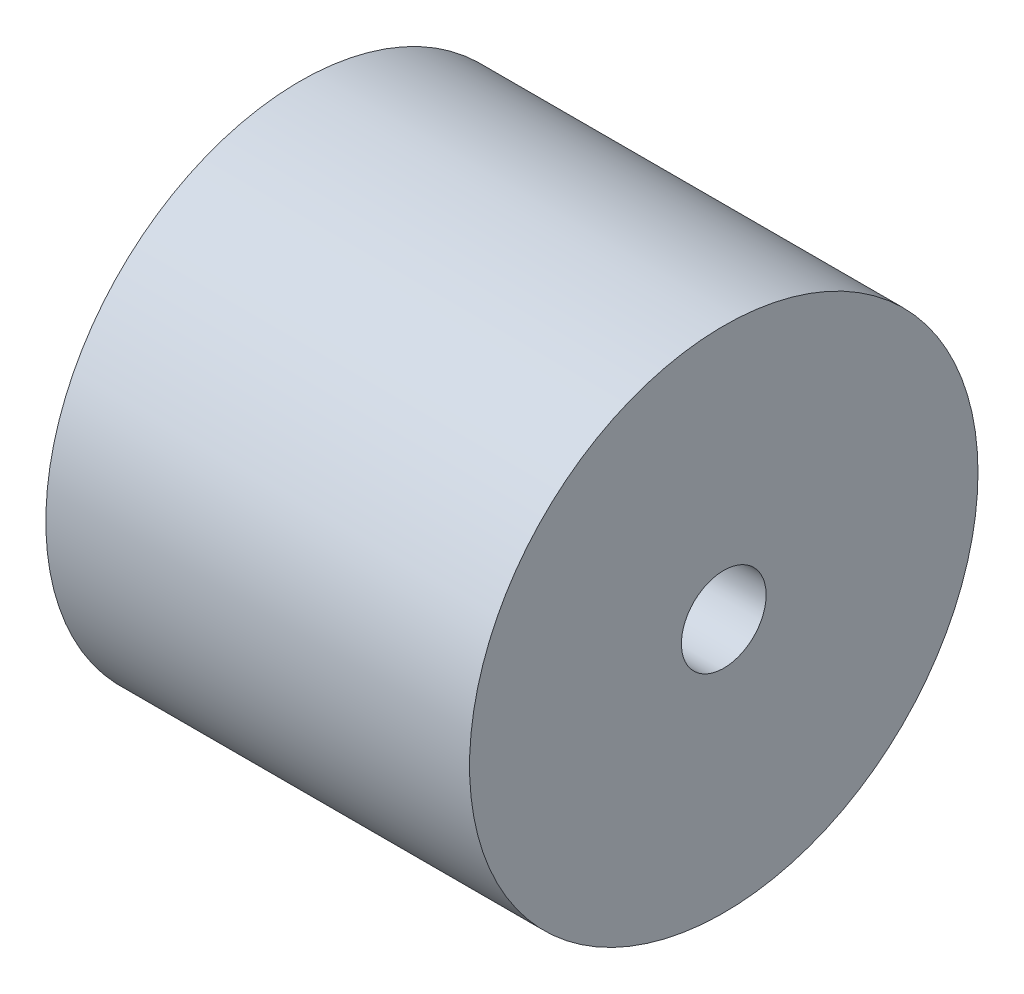
ISO-10303-21;
HEADER;
FILE_DESCRIPTION(('STEP AP214'),'2;1');
FILE_NAME('part.step','',(''),(''),'','','');
FILE_SCHEMA(('AUTOMOTIVE_DESIGN { 1 0 10303 214 1 1 1 1 }'));
ENDSEC;
DATA;
#1=APPLICATION_CONTEXT('core data for automotive mechanical design processes');
#2=APPLICATION_PROTOCOL_DEFINITION('international standard','automotive_design',2000,#1);
#3=PRODUCT_CONTEXT('',#1,'mechanical');
#4=PRODUCT('Part','Part','',(#3));
#5=PRODUCT_RELATED_PRODUCT_CATEGORY('part','',(#4));
#6=PRODUCT_DEFINITION_FORMATION('','',#4);
#7=PRODUCT_DEFINITION_CONTEXT('part definition',#1,'design');
#8=PRODUCT_DEFINITION('design','',#6,#7);
#9=PRODUCT_DEFINITION_SHAPE('','',#8);
#10=(LENGTH_UNIT() NAMED_UNIT(*) SI_UNIT(.MILLI.,.METRE.));
#11=(NAMED_UNIT(*) PLANE_ANGLE_UNIT() SI_UNIT($,.RADIAN.));
#12=(NAMED_UNIT(*) SI_UNIT($,.STERADIAN.) SOLID_ANGLE_UNIT());
#13=UNCERTAINTY_MEASURE_WITH_UNIT(LENGTH_MEASURE(1.E-05),#10,'distance_accuracy_value','');
#14=(GEOMETRIC_REPRESENTATION_CONTEXT(3) GLOBAL_UNCERTAINTY_ASSIGNED_CONTEXT((#13)) GLOBAL_UNIT_ASSIGNED_CONTEXT((#10,
#11,#12)) REPRESENTATION_CONTEXT('',''));
#15=CARTESIAN_POINT('',(0.,0.,0.));
#16=DIRECTION('',(0.,0.,1.));
#17=DIRECTION('',(1.,0.,0.));
#18=AXIS2_PLACEMENT_3D('',#15,#16,#17);
#19=CARTESIAN_POINT('',(30.,0.,0.));
#20=DIRECTION('',(-1.,0.,0.));
#21=DIRECTION('',(0.,0.,1.));
#22=AXIS2_PLACEMENT_3D('',#19,#20,#21);
#23=CYLINDRICAL_SURFACE('',#22,18.);
#24=CARTESIAN_POINT('',(30.,0.,0.));
#25=DIRECTION('',(1.,0.,0.));
#26=DIRECTION('',(0.,0.,-1.));
#27=AXIS2_PLACEMENT_3D('',#24,#25,#26);
#28=CIRCLE('',#27,18.);
#29=CARTESIAN_POINT('',(30.,0.,-18.));
#30=VERTEX_POINT('',#29);
#31=EDGE_CURVE('E10',#30,#30,#28,.T.);
#32=ORIENTED_EDGE('',*,*,#31,.F.);
#33=EDGE_LOOP('',(#32));
#34=FACE_BOUND('',#33,.T.);
#35=CARTESIAN_POINT('',(0.,0.,0.));
#36=DIRECTION('',(1.,0.,0.));
#37=DIRECTION('',(0.,0.,-1.));
#38=AXIS2_PLACEMENT_3D('',#35,#36,#37);
#39=CIRCLE('',#38,18.);
#40=CARTESIAN_POINT('',(0.,0.,-18.));
#41=VERTEX_POINT('',#40);
#42=EDGE_CURVE('E39',#41,#41,#39,.T.);
#43=ORIENTED_EDGE('',*,*,#42,.T.);
#44=EDGE_LOOP('',(#43));
#45=FACE_BOUND('',#44,.T.);
#46=ADVANCED_FACE('F36',(#34,#45),#23,.T.);
#47=CARTESIAN_POINT('',(30.,0.,0.));
#48=DIRECTION('',(1.,0.,0.));
#49=DIRECTION('',(0.,0.,-1.));
#50=AXIS2_PLACEMENT_3D('',#47,#48,#49);
#51=PLANE('',#50);
#52=CARTESIAN_POINT('',(30.,0.,0.));
#53=DIRECTION('',(1.,0.,0.));
#54=DIRECTION('',(0.,0.,-1.));
#55=AXIS2_PLACEMENT_3D('',#52,#53,#54);
#56=CIRCLE('',#55,3.);
#57=CARTESIAN_POINT('',(30.,0.,-3.));
#58=VERTEX_POINT('',#57);
#59=EDGE_CURVE('E46',#58,#58,#56,.T.);
#60=ORIENTED_EDGE('',*,*,#59,.F.);
#61=EDGE_LOOP('',(#60));
#62=FACE_BOUND('',#61,.T.);
#63=ORIENTED_EDGE('',*,*,#31,.T.);
#64=EDGE_LOOP('',(#63));
#65=FACE_BOUND('',#64,.T.);
#66=ADVANCED_FACE('F57',(#62,#65),#51,.T.);
#67=CARTESIAN_POINT('',(0.,0.,0.));
#68=DIRECTION('',(1.,0.,0.));
#69=DIRECTION('',(0.,0.,-1.));
#70=AXIS2_PLACEMENT_3D('',#67,#68,#69);
#71=PLANE('',#70);
#72=CARTESIAN_POINT('',(0.,0.,0.));
#73=DIRECTION('',(1.,0.,0.));
#74=DIRECTION('',(0.,0.,-1.));
#75=AXIS2_PLACEMENT_3D('',#72,#73,#74);
#76=CIRCLE('',#75,3.);
#77=CARTESIAN_POINT('',(0.,0.,-3.));
#78=VERTEX_POINT('',#77);
#79=EDGE_CURVE('E48',#78,#78,#76,.T.);
#80=ORIENTED_EDGE('',*,*,#79,.T.);
#81=EDGE_LOOP('',(#80));
#82=FACE_BOUND('',#81,.T.);
#83=ORIENTED_EDGE('',*,*,#42,.F.);
#84=EDGE_LOOP('',(#83));
#85=FACE_BOUND('',#84,.T.);
#86=ADVANCED_FACE('F59',(#82,#85),#71,.F.);
#87=CARTESIAN_POINT('',(30.,0.,0.));
#88=DIRECTION('',(-1.,0.,0.));
#89=DIRECTION('',(0.,0.,1.));
#90=AXIS2_PLACEMENT_3D('',#87,#88,#89);
#91=CYLINDRICAL_SURFACE('',#90,3.);
#92=ORIENTED_EDGE('',*,*,#59,.T.);
#93=EDGE_LOOP('',(#92));
#94=FACE_BOUND('',#93,.T.);
#95=ORIENTED_EDGE('',*,*,#79,.F.);
#96=EDGE_LOOP('',(#95));
#97=FACE_BOUND('',#96,.T.);
#98=ADVANCED_FACE('F54',(#94,#97),#91,.F.);
#99=CLOSED_SHELL('',(#46,#66,#86,#98));
#100=MANIFOLD_SOLID_BREP('B2',#99);
#101=ADVANCED_BREP_SHAPE_REPRESENTATION('',(#18,#100),#14);
#102=SHAPE_DEFINITION_REPRESENTATION(#9,#101);
ENDSEC;
END-ISO-10303-21;
